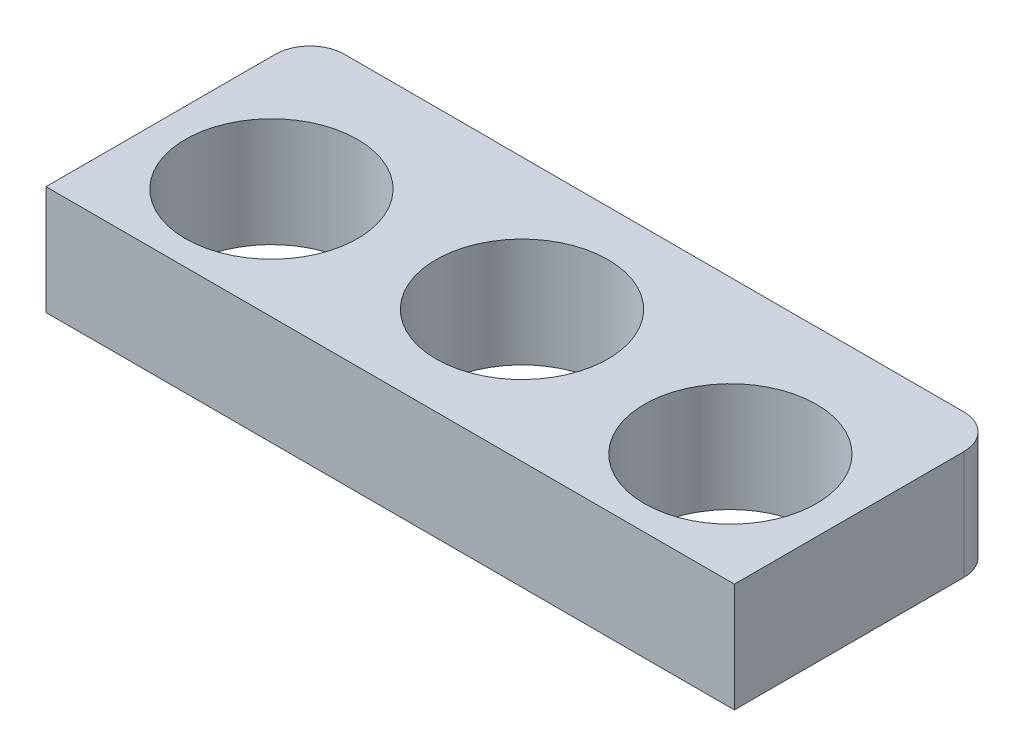
ISO-10303-21;
HEADER;
FILE_DESCRIPTION(('STEP AP214'),'2;1');
FILE_NAME('part.step','',(''),(''),'','','');
FILE_SCHEMA(('AUTOMOTIVE_DESIGN { 1 0 10303 214 1 1 1 1 }'));
ENDSEC;
DATA;
#1=APPLICATION_CONTEXT('core data for automotive mechanical design processes');
#2=APPLICATION_PROTOCOL_DEFINITION('international standard','automotive_design',2000,#1);
#3=PRODUCT_CONTEXT('',#1,'mechanical');
#4=PRODUCT('Part','Part','',(#3));
#5=PRODUCT_RELATED_PRODUCT_CATEGORY('part','',(#4));
#6=PRODUCT_DEFINITION_FORMATION('','',#4);
#7=PRODUCT_DEFINITION_CONTEXT('part definition',#1,'design');
#8=PRODUCT_DEFINITION('design','',#6,#7);
#9=PRODUCT_DEFINITION_SHAPE('','',#8);
#10=(LENGTH_UNIT() NAMED_UNIT(*) SI_UNIT(.MILLI.,.METRE.));
#11=(NAMED_UNIT(*) PLANE_ANGLE_UNIT() SI_UNIT($,.RADIAN.));
#12=(NAMED_UNIT(*) SI_UNIT($,.STERADIAN.) SOLID_ANGLE_UNIT());
#13=UNCERTAINTY_MEASURE_WITH_UNIT(LENGTH_MEASURE(1.E-05),#10,'distance_accuracy_value','');
#14=(GEOMETRIC_REPRESENTATION_CONTEXT(3) GLOBAL_UNCERTAINTY_ASSIGNED_CONTEXT((#13)) GLOBAL_UNIT_ASSIGNED_CONTEXT((#10,
#11,#12)) REPRESENTATION_CONTEXT('',''));
#15=CARTESIAN_POINT('',(0.,0.,0.));
#16=DIRECTION('',(0.,0.,1.));
#17=DIRECTION('',(1.,0.,0.));
#18=AXIS2_PLACEMENT_3D('',#15,#16,#17);
#19=CARTESIAN_POINT('',(30.,9.5,-23.));
#20=DIRECTION('',(-1.,0.,0.));
#21=DIRECTION('',(0.,0.,1.));
#22=AXIS2_PLACEMENT_3D('',#19,#20,#21);
#23=PLANE('',#22);
#24=DIRECTION('',(0.,0.,-1.));
#25=VECTOR('',#24,1.);
#26=CARTESIAN_POINT('',(30.,0.,-23.));
#27=LINE('',#26,#25);
#28=CARTESIAN_POINT('',(30.,0.,0.));
#29=VERTEX_POINT('',#28);
#30=CARTESIAN_POINT('',(30.,0.,-20.));
#31=VERTEX_POINT('',#30);
#32=EDGE_CURVE('E195',#29,#31,#27,.T.);
#33=ORIENTED_EDGE('',*,*,#32,.T.);
#34=DIRECTION('',(0.,-1.,0.));
#35=VECTOR('',#34,1.);
#36=CARTESIAN_POINT('',(30.,9.5,-20.));
#37=LINE('',#36,#35);
#38=CARTESIAN_POINT('',(30.,9.5,-20.));
#39=VERTEX_POINT('',#38);
#40=EDGE_CURVE('E119',#31,#39,#37,.F.);
#41=ORIENTED_EDGE('',*,*,#40,.T.);
#42=DIRECTION('',(0.,0.,-1.));
#43=VECTOR('',#42,1.);
#44=CARTESIAN_POINT('',(30.,9.5,-23.));
#45=LINE('',#44,#43);
#46=CARTESIAN_POINT('',(30.,9.5,0.));
#47=VERTEX_POINT('',#46);
#48=EDGE_CURVE('E113',#47,#39,#45,.T.);
#49=ORIENTED_EDGE('',*,*,#48,.F.);
#50=DIRECTION('',(0.,-1.,0.));
#51=VECTOR('',#50,1.);
#52=CARTESIAN_POINT('',(30.,9.5,0.));
#53=LINE('',#52,#51);
#54=EDGE_CURVE('E117',#47,#29,#53,.T.);
#55=ORIENTED_EDGE('',*,*,#54,.T.);
#56=EDGE_LOOP('',(#33,#41,#49,#55));
#57=FACE_BOUND('',#56,.T.);
#58=ADVANCED_FACE('F35',(#57),#23,.F.);
#59=CARTESIAN_POINT('',(14.,9.5,-23.));
#60=DIRECTION('',(0.,0.,1.));
#61=DIRECTION('',(1.,0.,0.));
#62=AXIS2_PLACEMENT_3D('',#59,#60,#61);
#63=PLANE('',#62);
#64=DIRECTION('',(-1.,0.,0.));
#65=VECTOR('',#64,1.);
#66=CARTESIAN_POINT('',(14.,9.5,-23.));
#67=LINE('',#66,#65);
#68=CARTESIAN_POINT('',(27.,9.5,-23.));
#69=VERTEX_POINT('',#68);
#70=CARTESIAN_POINT('',(14.,9.5,-23.));
#71=VERTEX_POINT('',#70);
#72=EDGE_CURVE('E121',#69,#71,#67,.T.);
#73=ORIENTED_EDGE('',*,*,#72,.F.);
#74=DIRECTION('',(0.,-1.,0.));
#75=VECTOR('',#74,1.);
#76=CARTESIAN_POINT('',(27.,9.5,-23.));
#77=LINE('',#76,#75);
#78=CARTESIAN_POINT('',(27.,0.,-23.));
#79=VERTEX_POINT('',#78);
#80=EDGE_CURVE('E135',#69,#79,#77,.T.);
#81=ORIENTED_EDGE('',*,*,#80,.T.);
#82=DIRECTION('',(-1.,0.,0.));
#83=VECTOR('',#82,1.);
#84=CARTESIAN_POINT('',(14.,0.,-23.));
#85=LINE('',#84,#83);
#86=CARTESIAN_POINT('',(14.,0.,-23.));
#87=VERTEX_POINT('',#86);
#88=EDGE_CURVE('E182',#79,#87,#85,.T.);
#89=ORIENTED_EDGE('',*,*,#88,.T.);
#90=DIRECTION('',(0.,-1.,0.));
#91=VECTOR('',#90,1.);
#92=CARTESIAN_POINT('',(14.,9.5,-23.));
#93=LINE('',#92,#91);
#94=EDGE_CURVE('E136',#71,#87,#93,.T.);
#95=ORIENTED_EDGE('',*,*,#94,.F.);
#96=EDGE_LOOP('',(#73,#81,#89,#95));
#97=FACE_BOUND('',#96,.T.);
#98=ADVANCED_FACE('F212',(#97),#63,.F.);
#99=CARTESIAN_POINT('',(-14.,9.5,-22.9888680901659));
#100=DIRECTION('',(0.,0.,1.));
#101=DIRECTION('',(1.,0.,0.));
#102=AXIS2_PLACEMENT_3D('',#99,#100,#101);
#103=PLANE('',#102);
#104=DIRECTION('',(-1.,0.,0.));
#105=VECTOR('',#104,1.);
#106=CARTESIAN_POINT('',(-14.,9.5,-22.9888680901659));
#107=LINE('',#106,#105);
#108=CARTESIAN_POINT('',(13.7417994198539,9.5,-22.9888680901659));
#109=VERTEX_POINT('',#108);
#110=CARTESIAN_POINT('',(-13.7417994198539,9.5,-22.9888680901659));
#111=VERTEX_POINT('',#110);
#112=EDGE_CURVE('E187',#109,#111,#107,.T.);
#113=ORIENTED_EDGE('',*,*,#112,.F.);
#114=DIRECTION('',(0.,-1.,0.));
#115=VECTOR('',#114,1.);
#116=CARTESIAN_POINT('',(13.7417994198539,9.5,-22.9888680901659));
#117=LINE('',#116,#115);
#118=CARTESIAN_POINT('',(13.7417994198539,0.,-22.9888680901659));
#119=VERTEX_POINT('',#118);
#120=EDGE_CURVE('E155',#109,#119,#117,.T.);
#121=ORIENTED_EDGE('',*,*,#120,.T.);
#122=DIRECTION('',(-1.,0.,0.));
#123=VECTOR('',#122,1.);
#124=CARTESIAN_POINT('',(-14.,0.,-22.9888680901659));
#125=LINE('',#124,#123);
#126=CARTESIAN_POINT('',(-13.7417994198539,0.,-22.9888680901659));
#127=VERTEX_POINT('',#126);
#128=EDGE_CURVE('E171',#119,#127,#125,.T.);
#129=ORIENTED_EDGE('',*,*,#128,.T.);
#130=DIRECTION('',(0.,1.,0.));
#131=VECTOR('',#130,1.);
#132=CARTESIAN_POINT('',(-13.7417994198539,9.5,-22.9888680901659));
#133=LINE('',#132,#131);
#134=EDGE_CURVE('E153',#127,#111,#133,.T.);
#135=ORIENTED_EDGE('',*,*,#134,.T.);
#136=EDGE_LOOP('',(#113,#121,#129,#135));
#137=FACE_BOUND('',#136,.T.);
#138=ADVANCED_FACE('F179',(#137),#103,.F.);
#139=CARTESIAN_POINT('',(-30.,9.5,-23.));
#140=DIRECTION('',(0.,0.,1.));
#141=DIRECTION('',(1.,0.,0.));
#142=AXIS2_PLACEMENT_3D('',#139,#140,#141);
#143=PLANE('',#142);
#144=DIRECTION('',(-1.,0.,0.));
#145=VECTOR('',#144,1.);
#146=CARTESIAN_POINT('',(-30.,0.,-23.));
#147=LINE('',#146,#145);
#148=CARTESIAN_POINT('',(-14.,0.,-23.));
#149=VERTEX_POINT('',#148);
#150=CARTESIAN_POINT('',(-27.,0.,-23.));
#151=VERTEX_POINT('',#150);
#152=EDGE_CURVE('E172',#149,#151,#147,.T.);
#153=ORIENTED_EDGE('',*,*,#152,.T.);
#154=DIRECTION('',(0.,-1.,0.));
#155=VECTOR('',#154,1.);
#156=CARTESIAN_POINT('',(-27.,9.5,-23.));
#157=LINE('',#156,#155);
#158=CARTESIAN_POINT('',(-27.,9.5,-23.));
#159=VERTEX_POINT('',#158);
#160=EDGE_CURVE('E58',#151,#159,#157,.F.);
#161=ORIENTED_EDGE('',*,*,#160,.T.);
#162=DIRECTION('',(-1.,0.,0.));
#163=VECTOR('',#162,1.);
#164=CARTESIAN_POINT('',(-30.,9.5,-23.));
#165=LINE('',#164,#163);
#166=CARTESIAN_POINT('',(-14.,9.5,-23.));
#167=VERTEX_POINT('',#166);
#168=EDGE_CURVE('E186',#167,#159,#165,.T.);
#169=ORIENTED_EDGE('',*,*,#168,.F.);
#170=DIRECTION('',(0.,-1.,0.));
#171=VECTOR('',#170,1.);
#172=CARTESIAN_POINT('',(-14.,9.5,-23.));
#173=LINE('',#172,#171);
#174=EDGE_CURVE('E142',#167,#149,#173,.T.);
#175=ORIENTED_EDGE('',*,*,#174,.T.);
#176=EDGE_LOOP('',(#153,#161,#169,#175));
#177=FACE_BOUND('',#176,.T.);
#178=ADVANCED_FACE('F188',(#177),#143,.F.);
#179=CARTESIAN_POINT('',(-30.,9.5,0.));
#180=DIRECTION('',(1.,0.,0.));
#181=DIRECTION('',(0.,0.,-1.));
#182=AXIS2_PLACEMENT_3D('',#179,#180,#181);
#183=PLANE('',#182);
#184=DIRECTION('',(0.,0.,1.));
#185=VECTOR('',#184,1.);
#186=CARTESIAN_POINT('',(-30.,9.5,0.));
#187=LINE('',#186,#185);
#188=CARTESIAN_POINT('',(-30.,9.5,-20.));
#189=VERTEX_POINT('',#188);
#190=CARTESIAN_POINT('',(-30.,9.5,0.));
#191=VERTEX_POINT('',#190);
#192=EDGE_CURVE('E126',#189,#191,#187,.T.);
#193=ORIENTED_EDGE('',*,*,#192,.F.);
#194=DIRECTION('',(0.,-1.,0.));
#195=VECTOR('',#194,1.);
#196=CARTESIAN_POINT('',(-30.,9.5,-20.));
#197=LINE('',#196,#195);
#198=CARTESIAN_POINT('',(-30.,0.,-20.));
#199=VERTEX_POINT('',#198);
#200=EDGE_CURVE('E158',#189,#199,#197,.T.);
#201=ORIENTED_EDGE('',*,*,#200,.T.);
#202=DIRECTION('',(0.,0.,1.));
#203=VECTOR('',#202,1.);
#204=CARTESIAN_POINT('',(-30.,0.,0.));
#205=LINE('',#204,#203);
#206=CARTESIAN_POINT('',(-30.,0.,0.));
#207=VERTEX_POINT('',#206);
#208=EDGE_CURVE('E201',#199,#207,#205,.T.);
#209=ORIENTED_EDGE('',*,*,#208,.T.);
#210=DIRECTION('',(0.,-1.,0.));
#211=VECTOR('',#210,1.);
#212=CARTESIAN_POINT('',(-30.,9.5,0.));
#213=LINE('',#212,#211);
#214=EDGE_CURVE('E190',#191,#207,#213,.T.);
#215=ORIENTED_EDGE('',*,*,#214,.F.);
#216=EDGE_LOOP('',(#193,#201,#209,#215));
#217=FACE_BOUND('',#216,.T.);
#218=ADVANCED_FACE('F282',(#217),#183,.F.);
#219=CARTESIAN_POINT('',(0.,9.5,0.));
#220=DIRECTION('',(0.,0.,-1.));
#221=DIRECTION('',(-1.,0.,0.));
#222=AXIS2_PLACEMENT_3D('',#219,#220,#221);
#223=PLANE('',#222);
#224=DIRECTION('',(1.,0.,0.));
#225=VECTOR('',#224,1.);
#226=CARTESIAN_POINT('',(0.,0.,0.));
#227=LINE('',#226,#225);
#228=EDGE_CURVE('E130',#207,#29,#227,.T.);
#229=ORIENTED_EDGE('',*,*,#228,.T.);
#230=ORIENTED_EDGE('',*,*,#54,.F.);
#231=DIRECTION('',(1.,0.,0.));
#232=VECTOR('',#231,1.);
#233=CARTESIAN_POINT('',(30.,9.5,0.));
#234=LINE('',#233,#232);
#235=EDGE_CURVE('E122',#191,#47,#234,.T.);
#236=ORIENTED_EDGE('',*,*,#235,.F.);
#237=ORIENTED_EDGE('',*,*,#214,.T.);
#238=EDGE_LOOP('',(#229,#230,#236,#237));
#239=FACE_BOUND('',#238,.T.);
#240=ADVANCED_FACE('F132',(#239),#223,.F.);
#241=CARTESIAN_POINT('',(0.,9.5,0.));
#242=DIRECTION('',(0.,-1.,0.));
#243=DIRECTION('',(0.,0.,-1.));
#244=AXIS2_PLACEMENT_3D('',#241,#242,#243);
#245=PLANE('',#244);
#246=CARTESIAN_POINT('',(20.,9.5,-9.65));
#247=DIRECTION('',(0.,1.,0.));
#248=DIRECTION('',(0.,0.,1.));
#249=AXIS2_PLACEMENT_3D('',#246,#247,#248);
#250=CIRCLE('',#249,7.5);
#251=CARTESIAN_POINT('',(20.,9.5,-2.15));
#252=VERTEX_POINT('',#251);
#253=EDGE_CURVE('E227',#252,#252,#250,.T.);
#254=ORIENTED_EDGE('',*,*,#253,.F.);
#255=EDGE_LOOP('',(#254));
#256=FACE_BOUND('',#255,.T.);
#257=CARTESIAN_POINT('',(-20.,9.5,-9.65));
#258=DIRECTION('',(0.,1.,0.));
#259=DIRECTION('',(0.,0.,1.));
#260=AXIS2_PLACEMENT_3D('',#257,#258,#259);
#261=CIRCLE('',#260,7.5);
#262=CARTESIAN_POINT('',(-20.,9.5,-2.15));
#263=VERTEX_POINT('',#262);
#264=EDGE_CURVE('E221',#263,#263,#261,.T.);
#265=ORIENTED_EDGE('',*,*,#264,.F.);
#266=EDGE_LOOP('',(#265));
#267=FACE_BOUND('',#266,.T.);
#268=CARTESIAN_POINT('',(0.,9.5,-11.4888680901659));
#269=DIRECTION('',(0.,1.,0.));
#270=DIRECTION('',(0.,0.,1.));
#271=AXIS2_PLACEMENT_3D('',#268,#269,#270);
#272=CIRCLE('',#271,7.5);
#273=CARTESIAN_POINT('',(0.,9.5,-3.98886809016595));
#274=VERTEX_POINT('',#273);
#275=EDGE_CURVE('E215',#274,#274,#272,.T.);
#276=ORIENTED_EDGE('',*,*,#275,.F.);
#277=EDGE_LOOP('',(#276));
#278=FACE_BOUND('',#277,.T.);
#279=ORIENTED_EDGE('',*,*,#48,.T.);
#280=CARTESIAN_POINT('',(27.,9.5,-20.));
#281=DIRECTION('',(0.,-1.,0.));
#282=DIRECTION('',(0.,0.,-1.));
#283=AXIS2_PLACEMENT_3D('',#280,#281,#282);
#284=CIRCLE('',#283,3.);
#285=EDGE_CURVE('E151',#39,#69,#284,.F.);
#286=ORIENTED_EDGE('',*,*,#285,.T.);
#287=ORIENTED_EDGE('',*,*,#72,.T.);
#288=CARTESIAN_POINT('',(13.7417994198539,9.5,-25.9888680901659));
#289=DIRECTION('',(0.,-1.,0.));
#290=DIRECTION('',(0.,0.,-1.));
#291=AXIS2_PLACEMENT_3D('',#288,#289,#290);
#292=CIRCLE('',#291,3.);
#293=EDGE_CURVE('E164',#71,#109,#292,.T.);
#294=ORIENTED_EDGE('',*,*,#293,.T.);
#295=ORIENTED_EDGE('',*,*,#112,.T.);
#296=CARTESIAN_POINT('',(-13.7417994198539,9.5,-25.9888680901659));
#297=DIRECTION('',(0.,-1.,0.));
#298=DIRECTION('',(0.,0.,-1.));
#299=AXIS2_PLACEMENT_3D('',#296,#297,#298);
#300=CIRCLE('',#299,3.);
#301=EDGE_CURVE('E11',#111,#167,#300,.T.);
#302=ORIENTED_EDGE('',*,*,#301,.T.);
#303=ORIENTED_EDGE('',*,*,#168,.T.);
#304=CARTESIAN_POINT('',(-27.,9.5,-20.));
#305=DIRECTION('',(0.,-1.,0.));
#306=DIRECTION('',(0.,0.,-1.));
#307=AXIS2_PLACEMENT_3D('',#304,#305,#306);
#308=CIRCLE('',#307,3.);
#309=EDGE_CURVE('E50',#159,#189,#308,.F.);
#310=ORIENTED_EDGE('',*,*,#309,.T.);
#311=ORIENTED_EDGE('',*,*,#192,.T.);
#312=ORIENTED_EDGE('',*,*,#235,.T.);
#313=EDGE_LOOP('',(#279,#286,#287,#294,#295,#302,#303,#310,#311,#312));
#314=FACE_BOUND('',#313,.T.);
#315=ADVANCED_FACE('F125',(#256,#267,#278,#314),#245,.F.);
#316=CARTESIAN_POINT('',(0.,0.,0.));
#317=DIRECTION('',(0.,-1.,0.));
#318=DIRECTION('',(0.,0.,-1.));
#319=AXIS2_PLACEMENT_3D('',#316,#317,#318);
#320=PLANE('',#319);
#321=CARTESIAN_POINT('',(20.,0.,-9.65));
#322=DIRECTION('',(0.,1.,0.));
#323=DIRECTION('',(0.,0.,1.));
#324=AXIS2_PLACEMENT_3D('',#321,#322,#323);
#325=CIRCLE('',#324,7.5);
#326=CARTESIAN_POINT('',(20.,0.,-2.15));
#327=VERTEX_POINT('',#326);
#328=EDGE_CURVE('E224',#327,#327,#325,.T.);
#329=ORIENTED_EDGE('',*,*,#328,.T.);
#330=EDGE_LOOP('',(#329));
#331=FACE_BOUND('',#330,.T.);
#332=CARTESIAN_POINT('',(-20.,0.,-9.65));
#333=DIRECTION('',(0.,1.,0.));
#334=DIRECTION('',(0.,0.,1.));
#335=AXIS2_PLACEMENT_3D('',#332,#333,#334);
#336=CIRCLE('',#335,7.5);
#337=CARTESIAN_POINT('',(-20.,0.,-2.15));
#338=VERTEX_POINT('',#337);
#339=EDGE_CURVE('E218',#338,#338,#336,.T.);
#340=ORIENTED_EDGE('',*,*,#339,.T.);
#341=EDGE_LOOP('',(#340));
#342=FACE_BOUND('',#341,.T.);
#343=CARTESIAN_POINT('',(0.,0.,-11.4888680901659));
#344=DIRECTION('',(0.,1.,0.));
#345=DIRECTION('',(0.,0.,1.));
#346=AXIS2_PLACEMENT_3D('',#343,#344,#345);
#347=CIRCLE('',#346,7.5);
#348=CARTESIAN_POINT('',(0.,0.,-3.98886809016595));
#349=VERTEX_POINT('',#348);
#350=EDGE_CURVE('E197',#349,#349,#347,.T.);
#351=ORIENTED_EDGE('',*,*,#350,.T.);
#352=EDGE_LOOP('',(#351));
#353=FACE_BOUND('',#352,.T.);
#354=ORIENTED_EDGE('',*,*,#88,.F.);
#355=CARTESIAN_POINT('',(27.,0.,-20.));
#356=DIRECTION('',(0.,-1.,0.));
#357=DIRECTION('',(0.,0.,-1.));
#358=AXIS2_PLACEMENT_3D('',#355,#356,#357);
#359=CIRCLE('',#358,3.);
#360=EDGE_CURVE('E147',#79,#31,#359,.T.);
#361=ORIENTED_EDGE('',*,*,#360,.T.);
#362=ORIENTED_EDGE('',*,*,#32,.F.);
#363=ORIENTED_EDGE('',*,*,#228,.F.);
#364=ORIENTED_EDGE('',*,*,#208,.F.);
#365=CARTESIAN_POINT('',(-27.,0.,-20.));
#366=DIRECTION('',(0.,-1.,0.));
#367=DIRECTION('',(0.,0.,-1.));
#368=AXIS2_PLACEMENT_3D('',#365,#366,#367);
#369=CIRCLE('',#368,3.);
#370=EDGE_CURVE('E139',#199,#151,#369,.T.);
#371=ORIENTED_EDGE('',*,*,#370,.T.);
#372=ORIENTED_EDGE('',*,*,#152,.F.);
#373=CARTESIAN_POINT('',(-13.7417994198539,0.,-25.9888680901659));
#374=DIRECTION('',(0.,-1.,0.));
#375=DIRECTION('',(0.,0.,-1.));
#376=AXIS2_PLACEMENT_3D('',#373,#374,#375);
#377=CIRCLE('',#376,3.);
#378=EDGE_CURVE('E43',#149,#127,#377,.F.);
#379=ORIENTED_EDGE('',*,*,#378,.T.);
#380=ORIENTED_EDGE('',*,*,#128,.F.);
#381=CARTESIAN_POINT('',(13.7417994198539,0.,-25.9888680901659));
#382=DIRECTION('',(0.,-1.,0.));
#383=DIRECTION('',(0.,0.,-1.));
#384=AXIS2_PLACEMENT_3D('',#381,#382,#383);
#385=CIRCLE('',#384,3.);
#386=EDGE_CURVE('E162',#119,#87,#385,.F.);
#387=ORIENTED_EDGE('',*,*,#386,.T.);
#388=EDGE_LOOP('',(#354,#361,#362,#363,#364,#371,#372,#379,#380,#387));
#389=FACE_BOUND('',#388,.T.);
#390=ADVANCED_FACE('F170',(#331,#342,#353,#389),#320,.T.);
#391=CARTESIAN_POINT('',(0.,0.,-11.4888680901659));
#392=DIRECTION('',(0.,1.,0.));
#393=DIRECTION('',(0.,0.,1.));
#394=AXIS2_PLACEMENT_3D('',#391,#392,#393);
#395=CYLINDRICAL_SURFACE('',#394,7.5);
#396=ORIENTED_EDGE('',*,*,#350,.F.);
#397=EDGE_LOOP('',(#396));
#398=FACE_BOUND('',#397,.T.);
#399=ORIENTED_EDGE('',*,*,#275,.T.);
#400=EDGE_LOOP('',(#399));
#401=FACE_BOUND('',#400,.T.);
#402=ADVANCED_FACE('F249',(#398,#401),#395,.F.);
#403=CARTESIAN_POINT('',(-20.,0.,-9.65));
#404=DIRECTION('',(0.,1.,0.));
#405=DIRECTION('',(0.,0.,1.));
#406=AXIS2_PLACEMENT_3D('',#403,#404,#405);
#407=CYLINDRICAL_SURFACE('',#406,7.5);
#408=ORIENTED_EDGE('',*,*,#339,.F.);
#409=EDGE_LOOP('',(#408));
#410=FACE_BOUND('',#409,.T.);
#411=ORIENTED_EDGE('',*,*,#264,.T.);
#412=EDGE_LOOP('',(#411));
#413=FACE_BOUND('',#412,.T.);
#414=ADVANCED_FACE('F238',(#410,#413),#407,.F.);
#415=CARTESIAN_POINT('',(20.,0.,-9.65));
#416=DIRECTION('',(0.,1.,0.));
#417=DIRECTION('',(0.,0.,1.));
#418=AXIS2_PLACEMENT_3D('',#415,#416,#417);
#419=CYLINDRICAL_SURFACE('',#418,7.5);
#420=ORIENTED_EDGE('',*,*,#328,.F.);
#421=EDGE_LOOP('',(#420));
#422=FACE_BOUND('',#421,.T.);
#423=ORIENTED_EDGE('',*,*,#253,.T.);
#424=EDGE_LOOP('',(#423));
#425=FACE_BOUND('',#424,.T.);
#426=ADVANCED_FACE('F235',(#422,#425),#419,.F.);
#427=CARTESIAN_POINT('',(27.,9.5,-20.));
#428=DIRECTION('',(0.,-1.,0.));
#429=DIRECTION('',(0.,0.,-1.));
#430=AXIS2_PLACEMENT_3D('',#427,#428,#429);
#431=CYLINDRICAL_SURFACE('',#430,3.);
#432=ORIENTED_EDGE('',*,*,#285,.F.);
#433=ORIENTED_EDGE('',*,*,#40,.F.);
#434=ORIENTED_EDGE('',*,*,#360,.F.);
#435=ORIENTED_EDGE('',*,*,#80,.F.);
#436=EDGE_LOOP('',(#432,#433,#434,#435));
#437=FACE_BOUND('',#436,.T.);
#438=ADVANCED_FACE('F207',(#437),#431,.T.);
#439=CARTESIAN_POINT('',(13.7417994198539,9.5,-25.9888680901659));
#440=DIRECTION('',(0.,-1.,0.));
#441=DIRECTION('',(0.,0.,-1.));
#442=AXIS2_PLACEMENT_3D('',#439,#440,#441);
#443=CYLINDRICAL_SURFACE('',#442,3.);
#444=ORIENTED_EDGE('',*,*,#293,.F.);
#445=ORIENTED_EDGE('',*,*,#94,.T.);
#446=ORIENTED_EDGE('',*,*,#386,.F.);
#447=ORIENTED_EDGE('',*,*,#120,.F.);
#448=EDGE_LOOP('',(#444,#445,#446,#447));
#449=FACE_BOUND('',#448,.T.);
#450=ADVANCED_FACE('F271',(#449),#443,.F.);
#451=CARTESIAN_POINT('',(-13.7417994198539,9.5,-25.9888680901659));
#452=DIRECTION('',(0.,1.,0.));
#453=DIRECTION('',(0.,0.,1.));
#454=AXIS2_PLACEMENT_3D('',#451,#452,#453);
#455=CYLINDRICAL_SURFACE('',#454,3.);
#456=ORIENTED_EDGE('',*,*,#301,.F.);
#457=ORIENTED_EDGE('',*,*,#134,.F.);
#458=ORIENTED_EDGE('',*,*,#378,.F.);
#459=ORIENTED_EDGE('',*,*,#174,.F.);
#460=EDGE_LOOP('',(#456,#457,#458,#459));
#461=FACE_BOUND('',#460,.T.);
#462=ADVANCED_FACE('F185',(#461),#455,.F.);
#463=CARTESIAN_POINT('',(-27.,9.5,-20.));
#464=DIRECTION('',(0.,-1.,0.));
#465=DIRECTION('',(0.,0.,-1.));
#466=AXIS2_PLACEMENT_3D('',#463,#464,#465);
#467=CYLINDRICAL_SURFACE('',#466,3.);
#468=ORIENTED_EDGE('',*,*,#309,.F.);
#469=ORIENTED_EDGE('',*,*,#160,.F.);
#470=ORIENTED_EDGE('',*,*,#370,.F.);
#471=ORIENTED_EDGE('',*,*,#200,.F.);
#472=EDGE_LOOP('',(#468,#469,#470,#471));
#473=FACE_BOUND('',#472,.T.);
#474=ADVANCED_FACE('F37',(#473),#467,.T.);
#475=CLOSED_SHELL('',(#58,#98,#138,#178,#218,#240,#315,#390,#402,#414,#426,#438,#450,#462,#474));
#476=MANIFOLD_SOLID_BREP('B2',#475);
#477=ADVANCED_BREP_SHAPE_REPRESENTATION('',(#18,#476),#14);
#478=SHAPE_DEFINITION_REPRESENTATION(#9,#477);
ENDSEC;
END-ISO-10303-21;
